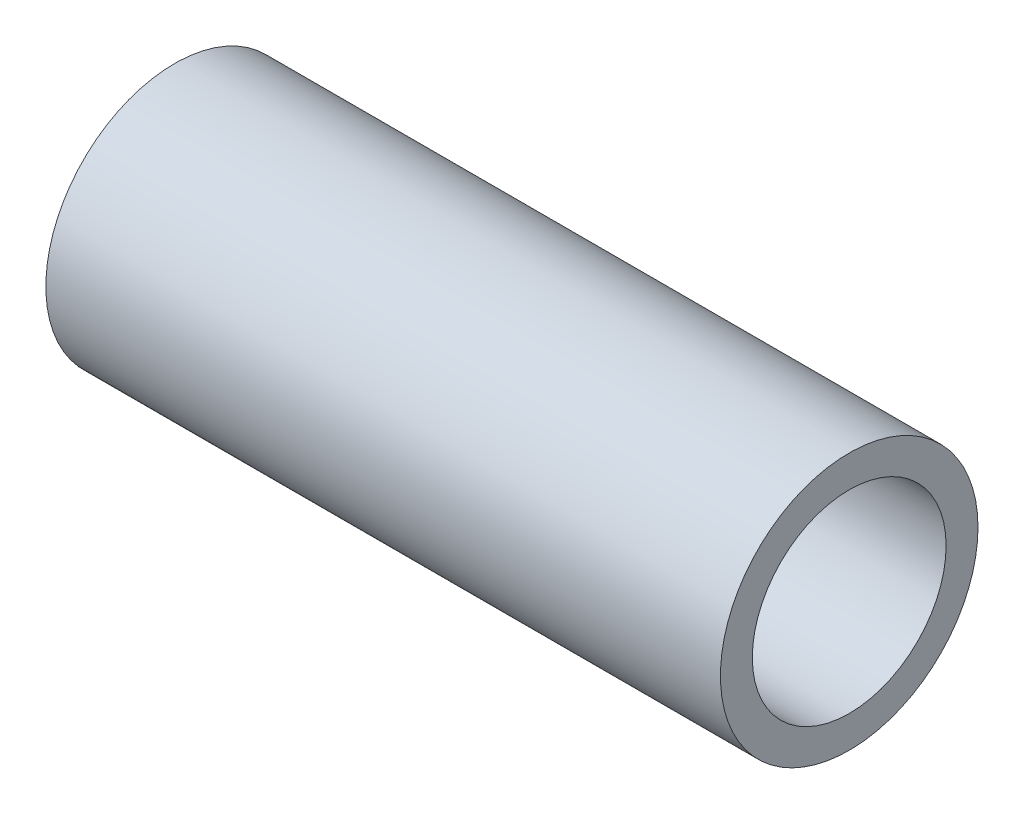
ISO-10303-21;
HEADER;
FILE_DESCRIPTION(('STEP AP214'),'2;1');
FILE_NAME('part.step','',(''),(''),'','','');
FILE_SCHEMA(('AUTOMOTIVE_DESIGN { 1 0 10303 214 1 1 1 1 }'));
ENDSEC;
DATA;
#1=APPLICATION_CONTEXT('core data for automotive mechanical design processes');
#2=APPLICATION_PROTOCOL_DEFINITION('international standard','automotive_design',2000,#1);
#3=PRODUCT_CONTEXT('',#1,'mechanical');
#4=PRODUCT('Part','Part','',(#3));
#5=PRODUCT_RELATED_PRODUCT_CATEGORY('part','',(#4));
#6=PRODUCT_DEFINITION_FORMATION('','',#4);
#7=PRODUCT_DEFINITION_CONTEXT('part definition',#1,'design');
#8=PRODUCT_DEFINITION('design','',#6,#7);
#9=PRODUCT_DEFINITION_SHAPE('','',#8);
#10=(LENGTH_UNIT() NAMED_UNIT(*) SI_UNIT(.MILLI.,.METRE.));
#11=(NAMED_UNIT(*) PLANE_ANGLE_UNIT() SI_UNIT($,.RADIAN.));
#12=(NAMED_UNIT(*) SI_UNIT($,.STERADIAN.) SOLID_ANGLE_UNIT());
#13=UNCERTAINTY_MEASURE_WITH_UNIT(LENGTH_MEASURE(1.E-05),#10,'distance_accuracy_value','');
#14=(GEOMETRIC_REPRESENTATION_CONTEXT(3) GLOBAL_UNCERTAINTY_ASSIGNED_CONTEXT((#13)) GLOBAL_UNIT_ASSIGNED_CONTEXT((#10,
#11,#12)) REPRESENTATION_CONTEXT('',''));
#15=CARTESIAN_POINT('',(0.,0.,0.));
#16=DIRECTION('',(0.,0.,1.));
#17=DIRECTION('',(1.,0.,0.));
#18=AXIS2_PLACEMENT_3D('',#15,#16,#17);
#19=CARTESIAN_POINT('',(55.,0.,0.));
#20=DIRECTION('',(1.,0.,0.));
#21=DIRECTION('',(0.,0.,-1.));
#22=AXIS2_PLACEMENT_3D('',#19,#20,#21);
#23=PLANE('',#22);
#24=CARTESIAN_POINT('',(55.,0.,0.));
#25=DIRECTION('',(1.,0.,0.));
#26=DIRECTION('',(0.,0.,-1.));
#27=AXIS2_PLACEMENT_3D('',#24,#25,#26);
#28=CIRCLE('',#27,10.5);
#29=CARTESIAN_POINT('',(55.,0.,-10.5));
#30=VERTEX_POINT('',#29);
#31=EDGE_CURVE('E10',#30,#30,#28,.T.);
#32=ORIENTED_EDGE('',*,*,#31,.T.);
#33=EDGE_LOOP('',(#32));
#34=FACE_BOUND('',#33,.T.);
#35=CARTESIAN_POINT('',(55.,0.,0.));
#36=DIRECTION('',(1.,0.,0.));
#37=DIRECTION('',(0.,0.,-1.));
#38=AXIS2_PLACEMENT_3D('',#35,#36,#37);
#39=CIRCLE('',#38,7.9);
#40=CARTESIAN_POINT('',(55.,0.,-7.9));
#41=VERTEX_POINT('',#40);
#42=EDGE_CURVE('E42',#41,#41,#39,.T.);
#43=ORIENTED_EDGE('',*,*,#42,.F.);
#44=EDGE_LOOP('',(#43));
#45=FACE_BOUND('',#44,.T.);
#46=ADVANCED_FACE('F31',(#34,#45),#23,.T.);
#47=CARTESIAN_POINT('',(0.,0.,0.));
#48=DIRECTION('',(1.,0.,0.));
#49=DIRECTION('',(0.,0.,-1.));
#50=AXIS2_PLACEMENT_3D('',#47,#48,#49);
#51=PLANE('',#50);
#52=CARTESIAN_POINT('',(0.,0.,0.));
#53=DIRECTION('',(1.,0.,0.));
#54=DIRECTION('',(0.,0.,-1.));
#55=AXIS2_PLACEMENT_3D('',#52,#53,#54);
#56=CIRCLE('',#55,10.5);
#57=CARTESIAN_POINT('',(0.,0.,-10.5));
#58=VERTEX_POINT('',#57);
#59=EDGE_CURVE('E35',#58,#58,#56,.T.);
#60=ORIENTED_EDGE('',*,*,#59,.F.);
#61=EDGE_LOOP('',(#60));
#62=FACE_BOUND('',#61,.T.);
#63=CARTESIAN_POINT('',(0.,0.,0.));
#64=DIRECTION('',(1.,0.,0.));
#65=DIRECTION('',(0.,0.,-1.));
#66=AXIS2_PLACEMENT_3D('',#63,#64,#65);
#67=CIRCLE('',#66,7.9);
#68=CARTESIAN_POINT('',(0.,0.,-7.9));
#69=VERTEX_POINT('',#68);
#70=EDGE_CURVE('E44',#69,#69,#67,.T.);
#71=ORIENTED_EDGE('',*,*,#70,.T.);
#72=EDGE_LOOP('',(#71));
#73=FACE_BOUND('',#72,.T.);
#74=ADVANCED_FACE('F54',(#62,#73),#51,.F.);
#75=CARTESIAN_POINT('',(55.,0.,0.));
#76=DIRECTION('',(-1.,0.,0.));
#77=DIRECTION('',(0.,0.,1.));
#78=AXIS2_PLACEMENT_3D('',#75,#76,#77);
#79=CYLINDRICAL_SURFACE('',#78,10.5);
#80=ORIENTED_EDGE('',*,*,#31,.F.);
#81=EDGE_LOOP('',(#80));
#82=FACE_BOUND('',#81,.T.);
#83=ORIENTED_EDGE('',*,*,#59,.T.);
#84=EDGE_LOOP('',(#83));
#85=FACE_BOUND('',#84,.T.);
#86=ADVANCED_FACE('F33',(#82,#85),#79,.T.);
#87=CARTESIAN_POINT('',(55.,0.,0.));
#88=DIRECTION('',(-1.,0.,0.));
#89=DIRECTION('',(0.,0.,1.));
#90=AXIS2_PLACEMENT_3D('',#87,#88,#89);
#91=CYLINDRICAL_SURFACE('',#90,7.9);
#92=ORIENTED_EDGE('',*,*,#42,.T.);
#93=EDGE_LOOP('',(#92));
#94=FACE_BOUND('',#93,.T.);
#95=ORIENTED_EDGE('',*,*,#70,.F.);
#96=EDGE_LOOP('',(#95));
#97=FACE_BOUND('',#96,.T.);
#98=ADVANCED_FACE('F50',(#94,#97),#91,.F.);
#99=CLOSED_SHELL('',(#46,#74,#86,#98));
#100=MANIFOLD_SOLID_BREP('B2',#99);
#101=ADVANCED_BREP_SHAPE_REPRESENTATION('',(#18,#100),#14);
#102=SHAPE_DEFINITION_REPRESENTATION(#9,#101);
ENDSEC;
END-ISO-10303-21;
